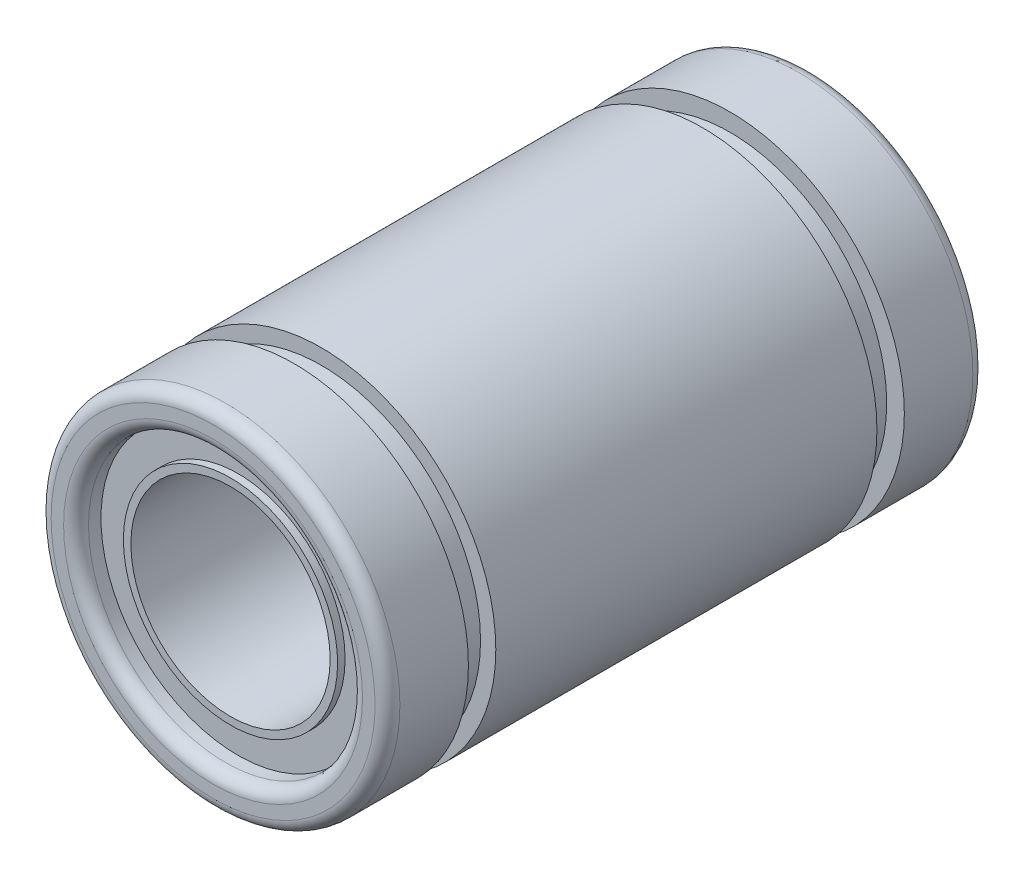
ISO-10303-21;
HEADER;
FILE_DESCRIPTION(('STEP AP214'),'2;1');
FILE_NAME('part.step','',(''),(''),'','','');
FILE_SCHEMA(('AUTOMOTIVE_DESIGN { 1 0 10303 214 1 1 1 1 }'));
ENDSEC;
DATA;
#1=APPLICATION_CONTEXT('core data for automotive mechanical design processes');
#2=APPLICATION_PROTOCOL_DEFINITION('international standard','automotive_design',2000,#1);
#3=PRODUCT_CONTEXT('',#1,'mechanical');
#4=PRODUCT('Part','Part','',(#3));
#5=PRODUCT_RELATED_PRODUCT_CATEGORY('part','',(#4));
#6=PRODUCT_DEFINITION_FORMATION('','',#4);
#7=PRODUCT_DEFINITION_CONTEXT('part definition',#1,'design');
#8=PRODUCT_DEFINITION('design','',#6,#7);
#9=PRODUCT_DEFINITION_SHAPE('','',#8);
#10=(LENGTH_UNIT() NAMED_UNIT(*) SI_UNIT(.MILLI.,.METRE.));
#11=(NAMED_UNIT(*) PLANE_ANGLE_UNIT() SI_UNIT($,.RADIAN.));
#12=(NAMED_UNIT(*) SI_UNIT($,.STERADIAN.) SOLID_ANGLE_UNIT());
#13=UNCERTAINTY_MEASURE_WITH_UNIT(LENGTH_MEASURE(1.E-05),#10,'distance_accuracy_value','');
#14=(GEOMETRIC_REPRESENTATION_CONTEXT(3) GLOBAL_UNCERTAINTY_ASSIGNED_CONTEXT((#13)) GLOBAL_UNIT_ASSIGNED_CONTEXT((#10,
#11,#12)) REPRESENTATION_CONTEXT('',''));
#15=CARTESIAN_POINT('',(0.,0.,0.));
#16=DIRECTION('',(0.,0.,1.));
#17=DIRECTION('',(1.,0.,0.));
#18=AXIS2_PLACEMENT_3D('',#15,#16,#17);
#19=CARTESIAN_POINT('',(0.,0.,-22.8609937436979));
#20=DIRECTION('',(0.,0.,-1.));
#21=DIRECTION('',(-1.,0.,0.));
#22=AXIS2_PLACEMENT_3D('',#19,#20,#21);
#23=PLANE('',#22);
#24=CARTESIAN_POINT('',(0.,0.,-22.8609937436979));
#25=DIRECTION('',(0.,0.,-1.));
#26=DIRECTION('',(-1.,0.,0.));
#27=AXIS2_PLACEMENT_3D('',#24,#25,#26);
#28=CIRCLE('',#27,5.5);
#29=CARTESIAN_POINT('',(-5.5,0.,-22.8609937436979));
#30=VERTEX_POINT('',#29);
#31=EDGE_CURVE('E91',#30,#30,#28,.T.);
#32=ORIENTED_EDGE('',*,*,#31,.T.);
#33=EDGE_LOOP('',(#32));
#34=FACE_BOUND('',#33,.T.);
#35=CARTESIAN_POINT('',(0.,0.,-22.8609937436979));
#36=DIRECTION('',(0.,0.,-1.));
#37=DIRECTION('',(-1.,0.,0.));
#38=AXIS2_PLACEMENT_3D('',#35,#36,#37);
#39=CIRCLE('',#38,4.3);
#40=CARTESIAN_POINT('',(-4.3,0.,-22.8609937436979));
#41=VERTEX_POINT('',#40);
#42=EDGE_CURVE('E104',#41,#41,#39,.T.);
#43=ORIENTED_EDGE('',*,*,#42,.F.);
#44=EDGE_LOOP('',(#43));
#45=FACE_BOUND('',#44,.T.);
#46=ADVANCED_FACE('F32',(#34,#45),#23,.T.);
#47=CARTESIAN_POINT('',(0.,0.,-0.860993743697869));
#48=DIRECTION('',(0.,0.,1.));
#49=DIRECTION('',(1.,0.,0.));
#50=AXIS2_PLACEMENT_3D('',#47,#48,#49);
#51=PLANE('',#50);
#52=CARTESIAN_POINT('',(0.,0.,-0.860993743697869));
#53=DIRECTION('',(0.,0.,1.));
#54=DIRECTION('',(1.,0.,0.));
#55=AXIS2_PLACEMENT_3D('',#52,#53,#54);
#56=CIRCLE('',#55,5.5);
#57=CARTESIAN_POINT('',(5.5,0.,-0.860993743697869));
#58=VERTEX_POINT('',#57);
#59=EDGE_CURVE('E88',#58,#58,#56,.T.);
#60=ORIENTED_EDGE('',*,*,#59,.T.);
#61=EDGE_LOOP('',(#60));
#62=FACE_BOUND('',#61,.T.);
#63=CARTESIAN_POINT('',(0.,0.,-0.860993743697869));
#64=DIRECTION('',(0.,0.,1.));
#65=DIRECTION('',(1.,0.,0.));
#66=AXIS2_PLACEMENT_3D('',#63,#64,#65);
#67=CIRCLE('',#66,4.3);
#68=CARTESIAN_POINT('',(4.3,0.,-0.860993743697869));
#69=VERTEX_POINT('',#68);
#70=EDGE_CURVE('E95',#69,#69,#67,.T.);
#71=ORIENTED_EDGE('',*,*,#70,.F.);
#72=EDGE_LOOP('',(#71));
#73=FACE_BOUND('',#72,.T.);
#74=ADVANCED_FACE('F131',(#62,#73),#51,.T.);
#75=CARTESIAN_POINT('',(0.,0.,0.));
#76=DIRECTION('',(0.,0.,1.));
#77=DIRECTION('',(1.,0.,0.));
#78=AXIS2_PLACEMENT_3D('',#75,#76,#77);
#79=CYLINDRICAL_SURFACE('',#78,4.);
#80=CARTESIAN_POINT('',(0.,0.,-0.560993743697869));
#81=DIRECTION('',(0.,0.,1.));
#82=DIRECTION('',(1.,0.,0.));
#83=AXIS2_PLACEMENT_3D('',#80,#81,#82);
#84=CIRCLE('',#83,4.);
#85=CARTESIAN_POINT('',(4.,0.,-0.560993743697869));
#86=VERTEX_POINT('',#85);
#87=EDGE_CURVE('E98',#86,#86,#84,.T.);
#88=ORIENTED_EDGE('',*,*,#87,.T.);
#89=EDGE_LOOP('',(#88));
#90=FACE_BOUND('',#89,.T.);
#91=CARTESIAN_POINT('',(0.,0.,-23.1609937436979));
#92=DIRECTION('',(0.,0.,-1.));
#93=DIRECTION('',(-1.,0.,0.));
#94=AXIS2_PLACEMENT_3D('',#91,#92,#93);
#95=CIRCLE('',#94,4.);
#96=CARTESIAN_POINT('',(-4.,0.,-23.1609937436979));
#97=VERTEX_POINT('',#96);
#98=EDGE_CURVE('E107',#97,#97,#95,.T.);
#99=ORIENTED_EDGE('',*,*,#98,.T.);
#100=EDGE_LOOP('',(#99));
#101=FACE_BOUND('',#100,.T.);
#102=ADVANCED_FACE('F113',(#90,#101),#79,.F.);
#103=CARTESIAN_POINT('',(0.,7.,0.139006256302131));
#104=DIRECTION('',(0.,0.,-1.));
#105=DIRECTION('',(-1.,0.,0.));
#106=AXIS2_PLACEMENT_3D('',#103,#104,#105);
#107=PLANE('',#106);
#108=CARTESIAN_POINT('',(0.,0.,0.139006256302131));
#109=DIRECTION('',(0.,0.,-1.));
#110=DIRECTION('',(-1.,0.,0.));
#111=AXIS2_PLACEMENT_3D('',#108,#109,#110);
#112=CIRCLE('',#111,6.);
#113=CARTESIAN_POINT('',(-6.,0.,0.139006256302131));
#114=VERTEX_POINT('',#113);
#115=EDGE_CURVE('E43',#114,#114,#112,.T.);
#116=ORIENTED_EDGE('',*,*,#115,.T.);
#117=EDGE_LOOP('',(#116));
#118=FACE_BOUND('',#117,.T.);
#119=CARTESIAN_POINT('',(0.,0.,0.139006256302131));
#120=DIRECTION('',(0.,0.,-1.));
#121=DIRECTION('',(-1.,0.,0.));
#122=AXIS2_PLACEMENT_3D('',#119,#120,#121);
#123=CIRCLE('',#122,6.5);
#124=CARTESIAN_POINT('',(-6.5,0.,0.139006256302131));
#125=VERTEX_POINT('',#124);
#126=EDGE_CURVE('E55',#125,#125,#123,.F.);
#127=ORIENTED_EDGE('',*,*,#126,.T.);
#128=EDGE_LOOP('',(#127));
#129=FACE_BOUND('',#128,.T.);
#130=ADVANCED_FACE('F191',(#118,#129),#107,.F.);
#131=CARTESIAN_POINT('',(0.,4.,-23.8609937436979));
#132=DIRECTION('',(0.,0.,1.));
#133=DIRECTION('',(1.,0.,0.));
#134=AXIS2_PLACEMENT_3D('',#131,#132,#133);
#135=PLANE('',#134);
#136=CARTESIAN_POINT('',(0.,0.,-23.8609937436979));
#137=DIRECTION('',(0.,0.,1.));
#138=DIRECTION('',(1.,0.,0.));
#139=AXIS2_PLACEMENT_3D('',#136,#137,#138);
#140=CIRCLE('',#139,6.);
#141=CARTESIAN_POINT('',(6.,0.,-23.8609937436979));
#142=VERTEX_POINT('',#141);
#143=EDGE_CURVE('E10',#142,#142,#140,.T.);
#144=ORIENTED_EDGE('',*,*,#143,.T.);
#145=EDGE_LOOP('',(#144));
#146=FACE_BOUND('',#145,.T.);
#147=CARTESIAN_POINT('',(0.,0.,-23.8609937436979));
#148=DIRECTION('',(0.,0.,1.));
#149=DIRECTION('',(1.,0.,0.));
#150=AXIS2_PLACEMENT_3D('',#147,#148,#149);
#151=CIRCLE('',#150,6.5);
#152=CARTESIAN_POINT('',(6.5,0.,-23.8609937436979));
#153=VERTEX_POINT('',#152);
#154=EDGE_CURVE('E58',#153,#153,#151,.F.);
#155=ORIENTED_EDGE('',*,*,#154,.T.);
#156=EDGE_LOOP('',(#155));
#157=FACE_BOUND('',#156,.T.);
#158=ADVANCED_FACE('F187',(#146,#157),#135,.F.);
#159=CARTESIAN_POINT('',(0.,0.,0.));
#160=DIRECTION('',(0.,0.,1.));
#161=DIRECTION('',(1.,0.,0.));
#162=AXIS2_PLACEMENT_3D('',#159,#160,#161);
#163=CYLINDRICAL_SURFACE('',#162,7.);
#164=CARTESIAN_POINT('',(0.,0.,-23.3609937436979));
#165=DIRECTION('',(0.,0.,1.));
#166=DIRECTION('',(1.,0.,0.));
#167=AXIS2_PLACEMENT_3D('',#164,#165,#166);
#168=CIRCLE('',#167,7.);
#169=CARTESIAN_POINT('',(7.,0.,-23.3609937436979));
#170=VERTEX_POINT('',#169);
#171=EDGE_CURVE('E61',#170,#170,#168,.T.);
#172=ORIENTED_EDGE('',*,*,#171,.T.);
#173=EDGE_LOOP('',(#172));
#174=FACE_BOUND('',#173,.T.);
#175=CARTESIAN_POINT('',(0.,0.,-20.6109937436979));
#176=DIRECTION('',(0.,0.,1.));
#177=DIRECTION('',(1.,0.,0.));
#178=AXIS2_PLACEMENT_3D('',#175,#176,#177);
#179=CIRCLE('',#178,7.);
#180=CARTESIAN_POINT('',(7.,0.,-20.6109937436979));
#181=VERTEX_POINT('',#180);
#182=EDGE_CURVE('E64',#181,#181,#179,.T.);
#183=ORIENTED_EDGE('',*,*,#182,.F.);
#184=EDGE_LOOP('',(#183));
#185=FACE_BOUND('',#184,.T.);
#186=ADVANCED_FACE('F183',(#174,#185),#163,.T.);
#187=CARTESIAN_POINT('',(0.,7.,-20.6109937436979));
#188=DIRECTION('',(0.,0.,-1.));
#189=DIRECTION('',(-1.,0.,0.));
#190=AXIS2_PLACEMENT_3D('',#187,#188,#189);
#191=PLANE('',#190);
#192=CARTESIAN_POINT('',(0.,0.,-20.6109937436979));
#193=DIRECTION('',(0.,0.,1.));
#194=DIRECTION('',(1.,0.,0.));
#195=AXIS2_PLACEMENT_3D('',#192,#193,#194);
#196=CIRCLE('',#195,6.29198493118997);
#197=CARTESIAN_POINT('',(6.29198493118997,0.,-20.6109937436979));
#198=VERTEX_POINT('',#197);
#199=EDGE_CURVE('E67',#198,#198,#196,.T.);
#200=ORIENTED_EDGE('',*,*,#199,.F.);
#201=EDGE_LOOP('',(#200));
#202=FACE_BOUND('',#201,.T.);
#203=ORIENTED_EDGE('',*,*,#182,.T.);
#204=EDGE_LOOP('',(#203));
#205=FACE_BOUND('',#204,.T.);
#206=ADVANCED_FACE('F179',(#202,#205),#191,.F.);
#207=CARTESIAN_POINT('',(0.,0.,0.));
#208=DIRECTION('',(0.,0.,1.));
#209=DIRECTION('',(1.,0.,0.));
#210=AXIS2_PLACEMENT_3D('',#207,#208,#209);
#211=CYLINDRICAL_SURFACE('',#210,6.29198493118997);
#212=CARTESIAN_POINT('',(0.,0.,-19.5109937436979));
#213=DIRECTION('',(0.,0.,1.));
#214=DIRECTION('',(1.,0.,0.));
#215=AXIS2_PLACEMENT_3D('',#212,#213,#214);
#216=CIRCLE('',#215,6.29198493118997);
#217=CARTESIAN_POINT('',(6.29198493118997,0.,-19.5109937436979));
#218=VERTEX_POINT('',#217);
#219=EDGE_CURVE('E70',#218,#218,#216,.T.);
#220=ORIENTED_EDGE('',*,*,#219,.F.);
#221=EDGE_LOOP('',(#220));
#222=FACE_BOUND('',#221,.T.);
#223=ORIENTED_EDGE('',*,*,#199,.T.);
#224=EDGE_LOOP('',(#223));
#225=FACE_BOUND('',#224,.T.);
#226=ADVANCED_FACE('F175',(#222,#225),#211,.T.);
#227=CARTESIAN_POINT('',(0.,6.29198493118997,-19.5109937436979));
#228=DIRECTION('',(0.,0.,1.));
#229=DIRECTION('',(1.,0.,0.));
#230=AXIS2_PLACEMENT_3D('',#227,#228,#229);
#231=PLANE('',#230);
#232=CARTESIAN_POINT('',(0.,0.,-19.5109937436979));
#233=DIRECTION('',(0.,0.,1.));
#234=DIRECTION('',(1.,0.,0.));
#235=AXIS2_PLACEMENT_3D('',#232,#233,#234);
#236=CIRCLE('',#235,7.);
#237=CARTESIAN_POINT('',(7.,0.,-19.5109937436979));
#238=VERTEX_POINT('',#237);
#239=EDGE_CURVE('E73',#238,#238,#236,.T.);
#240=ORIENTED_EDGE('',*,*,#239,.F.);
#241=EDGE_LOOP('',(#240));
#242=FACE_BOUND('',#241,.T.);
#243=ORIENTED_EDGE('',*,*,#219,.T.);
#244=EDGE_LOOP('',(#243));
#245=FACE_BOUND('',#244,.T.);
#246=ADVANCED_FACE('F171',(#242,#245),#231,.F.);
#247=CARTESIAN_POINT('',(0.,0.,0.));
#248=DIRECTION('',(0.,0.,1.));
#249=DIRECTION('',(1.,0.,0.));
#250=AXIS2_PLACEMENT_3D('',#247,#248,#249);
#251=CYLINDRICAL_SURFACE('',#250,7.);
#252=CARTESIAN_POINT('',(0.,0.,-4.21099374369787));
#253=DIRECTION('',(0.,0.,1.));
#254=DIRECTION('',(1.,0.,0.));
#255=AXIS2_PLACEMENT_3D('',#252,#253,#254);
#256=CIRCLE('',#255,7.);
#257=CARTESIAN_POINT('',(7.,0.,-4.21099374369787));
#258=VERTEX_POINT('',#257);
#259=EDGE_CURVE('E76',#258,#258,#256,.T.);
#260=ORIENTED_EDGE('',*,*,#259,.F.);
#261=EDGE_LOOP('',(#260));
#262=FACE_BOUND('',#261,.T.);
#263=ORIENTED_EDGE('',*,*,#239,.T.);
#264=EDGE_LOOP('',(#263));
#265=FACE_BOUND('',#264,.T.);
#266=ADVANCED_FACE('F167',(#262,#265),#251,.T.);
#267=CARTESIAN_POINT('',(0.,7.,-4.21099374369787));
#268=DIRECTION('',(0.,0.,-1.));
#269=DIRECTION('',(-1.,0.,0.));
#270=AXIS2_PLACEMENT_3D('',#267,#268,#269);
#271=PLANE('',#270);
#272=CARTESIAN_POINT('',(0.,0.,-4.21099374369787));
#273=DIRECTION('',(0.,0.,1.));
#274=DIRECTION('',(1.,0.,0.));
#275=AXIS2_PLACEMENT_3D('',#272,#273,#274);
#276=CIRCLE('',#275,6.38690547675423);
#277=CARTESIAN_POINT('',(6.38690547675423,0.,-4.21099374369787));
#278=VERTEX_POINT('',#277);
#279=EDGE_CURVE('E79',#278,#278,#276,.T.);
#280=ORIENTED_EDGE('',*,*,#279,.F.);
#281=EDGE_LOOP('',(#280));
#282=FACE_BOUND('',#281,.T.);
#283=ORIENTED_EDGE('',*,*,#259,.T.);
#284=EDGE_LOOP('',(#283));
#285=FACE_BOUND('',#284,.T.);
#286=ADVANCED_FACE('F163',(#282,#285),#271,.F.);
#287=CARTESIAN_POINT('',(0.,0.,0.));
#288=DIRECTION('',(0.,0.,1.));
#289=DIRECTION('',(1.,0.,0.));
#290=AXIS2_PLACEMENT_3D('',#287,#288,#289);
#291=CYLINDRICAL_SURFACE('',#290,6.38690547675423);
#292=CARTESIAN_POINT('',(0.,0.,-3.11099374369787));
#293=DIRECTION('',(0.,0.,1.));
#294=DIRECTION('',(1.,0.,0.));
#295=AXIS2_PLACEMENT_3D('',#292,#293,#294);
#296=CIRCLE('',#295,6.38690547675423);
#297=CARTESIAN_POINT('',(6.38690547675423,0.,-3.11099374369787));
#298=VERTEX_POINT('',#297);
#299=EDGE_CURVE('E82',#298,#298,#296,.T.);
#300=ORIENTED_EDGE('',*,*,#299,.F.);
#301=EDGE_LOOP('',(#300));
#302=FACE_BOUND('',#301,.T.);
#303=ORIENTED_EDGE('',*,*,#279,.T.);
#304=EDGE_LOOP('',(#303));
#305=FACE_BOUND('',#304,.T.);
#306=ADVANCED_FACE('F159',(#302,#305),#291,.T.);
#307=CARTESIAN_POINT('',(0.,6.38690547675423,-3.11099374369787));
#308=DIRECTION('',(0.,0.,1.));
#309=DIRECTION('',(1.,0.,0.));
#310=AXIS2_PLACEMENT_3D('',#307,#308,#309);
#311=PLANE('',#310);
#312=CARTESIAN_POINT('',(0.,0.,-3.11099374369787));
#313=DIRECTION('',(0.,0.,1.));
#314=DIRECTION('',(1.,0.,0.));
#315=AXIS2_PLACEMENT_3D('',#312,#313,#314);
#316=CIRCLE('',#315,7.);
#317=CARTESIAN_POINT('',(7.,0.,-3.11099374369787));
#318=VERTEX_POINT('',#317);
#319=EDGE_CURVE('E85',#318,#318,#316,.T.);
#320=ORIENTED_EDGE('',*,*,#319,.F.);
#321=EDGE_LOOP('',(#320));
#322=FACE_BOUND('',#321,.T.);
#323=ORIENTED_EDGE('',*,*,#299,.T.);
#324=EDGE_LOOP('',(#323));
#325=FACE_BOUND('',#324,.T.);
#326=ADVANCED_FACE('F155',(#322,#325),#311,.F.);
#327=CARTESIAN_POINT('',(0.,0.,0.));
#328=DIRECTION('',(0.,0.,1.));
#329=DIRECTION('',(1.,0.,0.));
#330=AXIS2_PLACEMENT_3D('',#327,#328,#329);
#331=CYLINDRICAL_SURFACE('',#330,7.);
#332=CARTESIAN_POINT('',(0.,0.,-0.360993743697869));
#333=DIRECTION('',(0.,0.,-1.));
#334=DIRECTION('',(-1.,0.,0.));
#335=AXIS2_PLACEMENT_3D('',#332,#333,#334);
#336=CIRCLE('',#335,7.);
#337=CARTESIAN_POINT('',(-7.,0.,-0.360993743697869));
#338=VERTEX_POINT('',#337);
#339=EDGE_CURVE('E52',#338,#338,#336,.T.);
#340=ORIENTED_EDGE('',*,*,#339,.T.);
#341=EDGE_LOOP('',(#340));
#342=FACE_BOUND('',#341,.T.);
#343=ORIENTED_EDGE('',*,*,#319,.T.);
#344=EDGE_LOOP('',(#343));
#345=FACE_BOUND('',#344,.T.);
#346=ADVANCED_FACE('F151',(#342,#345),#331,.T.);
#347=CARTESIAN_POINT('',(0.,0.,-23.3609937436979));
#348=DIRECTION('',(0.,0.,1.));
#349=DIRECTION('',(1.,0.,0.));
#350=AXIS2_PLACEMENT_3D('',#347,#348,#349);
#351=TOROIDAL_SURFACE('',#350,6.5,0.5);
#352=ORIENTED_EDGE('',*,*,#154,.F.);
#353=EDGE_LOOP('',(#352));
#354=FACE_BOUND('',#353,.T.);
#355=ORIENTED_EDGE('',*,*,#171,.F.);
#356=EDGE_LOOP('',(#355));
#357=FACE_BOUND('',#356,.T.);
#358=ADVANCED_FACE('F154',(#354,#357),#351,.T.);
#359=CARTESIAN_POINT('',(0.,0.,-0.360993743697869));
#360=DIRECTION('',(0.,0.,-1.));
#361=DIRECTION('',(-1.,0.,0.));
#362=AXIS2_PLACEMENT_3D('',#359,#360,#361);
#363=TOROIDAL_SURFACE('',#362,6.5,0.5);
#364=ORIENTED_EDGE('',*,*,#339,.F.);
#365=EDGE_LOOP('',(#364));
#366=FACE_BOUND('',#365,.T.);
#367=ORIENTED_EDGE('',*,*,#126,.F.);
#368=EDGE_LOOP('',(#367));
#369=FACE_BOUND('',#368,.T.);
#370=ADVANCED_FACE('F149',(#366,#369),#363,.T.);
#371=CARTESIAN_POINT('',(0.,0.,-0.860993743697869));
#372=DIRECTION('',(0.,0.,1.));
#373=DIRECTION('',(1.,0.,0.));
#374=AXIS2_PLACEMENT_3D('',#371,#372,#373);
#375=CYLINDRICAL_SURFACE('',#374,5.5);
#376=CARTESIAN_POINT('',(0.,0.,-0.360993743697869));
#377=DIRECTION('',(0.,0.,-1.));
#378=DIRECTION('',(-1.,0.,0.));
#379=AXIS2_PLACEMENT_3D('',#376,#377,#378);
#380=CIRCLE('',#379,5.5);
#381=CARTESIAN_POINT('',(-5.5,0.,-0.360993743697869));
#382=VERTEX_POINT('',#381);
#383=EDGE_CURVE('E47',#382,#382,#380,.F.);
#384=ORIENTED_EDGE('',*,*,#383,.T.);
#385=EDGE_LOOP('',(#384));
#386=FACE_BOUND('',#385,.T.);
#387=ORIENTED_EDGE('',*,*,#59,.F.);
#388=EDGE_LOOP('',(#387));
#389=FACE_BOUND('',#388,.T.);
#390=ADVANCED_FACE('F146',(#386,#389),#375,.F.);
#391=CARTESIAN_POINT('',(0.,0.,-0.360993743697869));
#392=DIRECTION('',(0.,0.,-1.));
#393=DIRECTION('',(-1.,0.,0.));
#394=AXIS2_PLACEMENT_3D('',#391,#392,#393);
#395=TOROIDAL_SURFACE('',#394,6.,0.5);
#396=ORIENTED_EDGE('',*,*,#115,.F.);
#397=EDGE_LOOP('',(#396));
#398=FACE_BOUND('',#397,.T.);
#399=ORIENTED_EDGE('',*,*,#383,.F.);
#400=EDGE_LOOP('',(#399));
#401=FACE_BOUND('',#400,.T.);
#402=ADVANCED_FACE('F144',(#398,#401),#395,.T.);
#403=CARTESIAN_POINT('',(0.,0.,-22.8609937436979));
#404=DIRECTION('',(0.,0.,-1.));
#405=DIRECTION('',(-1.,0.,0.));
#406=AXIS2_PLACEMENT_3D('',#403,#404,#405);
#407=CYLINDRICAL_SURFACE('',#406,5.5);
#408=CARTESIAN_POINT('',(0.,0.,-23.3609937436979));
#409=DIRECTION('',(0.,0.,1.));
#410=DIRECTION('',(1.,0.,0.));
#411=AXIS2_PLACEMENT_3D('',#408,#409,#410);
#412=CIRCLE('',#411,5.5);
#413=CARTESIAN_POINT('',(5.5,0.,-23.3609937436979));
#414=VERTEX_POINT('',#413);
#415=EDGE_CURVE('E39',#414,#414,#412,.F.);
#416=ORIENTED_EDGE('',*,*,#415,.T.);
#417=EDGE_LOOP('',(#416));
#418=FACE_BOUND('',#417,.T.);
#419=ORIENTED_EDGE('',*,*,#31,.F.);
#420=EDGE_LOOP('',(#419));
#421=FACE_BOUND('',#420,.T.);
#422=ADVANCED_FACE('F142',(#418,#421),#407,.F.);
#423=CARTESIAN_POINT('',(0.,0.,-23.3609937436979));
#424=DIRECTION('',(0.,0.,1.));
#425=DIRECTION('',(1.,0.,0.));
#426=AXIS2_PLACEMENT_3D('',#423,#424,#425);
#427=TOROIDAL_SURFACE('',#426,6.,0.5);
#428=ORIENTED_EDGE('',*,*,#143,.F.);
#429=EDGE_LOOP('',(#428));
#430=FACE_BOUND('',#429,.T.);
#431=ORIENTED_EDGE('',*,*,#415,.F.);
#432=EDGE_LOOP('',(#431));
#433=FACE_BOUND('',#432,.T.);
#434=ADVANCED_FACE('F34',(#430,#433),#427,.T.);
#435=CARTESIAN_POINT('',(0.,0.,-0.560993743697869));
#436=DIRECTION('',(0.,0.,1.));
#437=DIRECTION('',(1.,0.,0.));
#438=AXIS2_PLACEMENT_3D('',#435,#436,#437);
#439=PLANE('',#438);
#440=CARTESIAN_POINT('',(0.,0.,-0.560993743697869));
#441=DIRECTION('',(0.,0.,1.));
#442=DIRECTION('',(1.,0.,0.));
#443=AXIS2_PLACEMENT_3D('',#440,#441,#442);
#444=CIRCLE('',#443,4.3);
#445=CARTESIAN_POINT('',(4.3,0.,-0.560993743697869));
#446=VERTEX_POINT('',#445);
#447=EDGE_CURVE('E94',#446,#446,#444,.T.);
#448=ORIENTED_EDGE('',*,*,#447,.T.);
#449=EDGE_LOOP('',(#448));
#450=FACE_BOUND('',#449,.T.);
#451=ORIENTED_EDGE('',*,*,#87,.F.);
#452=EDGE_LOOP('',(#451));
#453=FACE_BOUND('',#452,.T.);
#454=ADVANCED_FACE('F127',(#450,#453),#439,.T.);
#455=CARTESIAN_POINT('',(0.,0.,-0.560993743697869));
#456=DIRECTION('',(0.,0.,-1.));
#457=DIRECTION('',(-1.,0.,0.));
#458=AXIS2_PLACEMENT_3D('',#455,#456,#457);
#459=CYLINDRICAL_SURFACE('',#458,4.3);
#460=ORIENTED_EDGE('',*,*,#447,.F.);
#461=EDGE_LOOP('',(#460));
#462=FACE_BOUND('',#461,.T.);
#463=ORIENTED_EDGE('',*,*,#70,.T.);
#464=EDGE_LOOP('',(#463));
#465=FACE_BOUND('',#464,.T.);
#466=ADVANCED_FACE('F118',(#462,#465),#459,.T.);
#467=CARTESIAN_POINT('',(0.,0.,-23.1609937436979));
#468=DIRECTION('',(0.,0.,-1.));
#469=DIRECTION('',(-1.,0.,0.));
#470=AXIS2_PLACEMENT_3D('',#467,#468,#469);
#471=PLANE('',#470);
#472=CARTESIAN_POINT('',(0.,0.,-23.1609937436979));
#473=DIRECTION('',(0.,0.,-1.));
#474=DIRECTION('',(-1.,0.,0.));
#475=AXIS2_PLACEMENT_3D('',#472,#473,#474);
#476=CIRCLE('',#475,4.3);
#477=CARTESIAN_POINT('',(-4.3,0.,-23.1609937436979));
#478=VERTEX_POINT('',#477);
#479=EDGE_CURVE('E103',#478,#478,#476,.T.);
#480=ORIENTED_EDGE('',*,*,#479,.T.);
#481=EDGE_LOOP('',(#480));
#482=FACE_BOUND('',#481,.T.);
#483=ORIENTED_EDGE('',*,*,#98,.F.);
#484=EDGE_LOOP('',(#483));
#485=FACE_BOUND('',#484,.T.);
#486=ADVANCED_FACE('F115',(#482,#485),#471,.T.);
#487=CARTESIAN_POINT('',(0.,0.,-23.1609937436979));
#488=DIRECTION('',(0.,0.,1.));
#489=DIRECTION('',(1.,0.,0.));
#490=AXIS2_PLACEMENT_3D('',#487,#488,#489);
#491=CYLINDRICAL_SURFACE('',#490,4.3);
#492=ORIENTED_EDGE('',*,*,#479,.F.);
#493=EDGE_LOOP('',(#492));
#494=FACE_BOUND('',#493,.T.);
#495=ORIENTED_EDGE('',*,*,#42,.T.);
#496=EDGE_LOOP('',(#495));
#497=FACE_BOUND('',#496,.T.);
#498=ADVANCED_FACE('F117',(#494,#497),#491,.T.);
#499=CLOSED_SHELL('',(#46,#74,#102,#130,#158,#186,#206,#226,#246,#266,#286,#306,#326,#346,#358,
#370,#390,#402,#422,#434,#454,#466,#486,#498));
#500=MANIFOLD_SOLID_BREP('B2',#499);
#501=ADVANCED_BREP_SHAPE_REPRESENTATION('',(#18,#500),#14);
#502=SHAPE_DEFINITION_REPRESENTATION(#9,#501);
ENDSEC;
END-ISO-10303-21;
